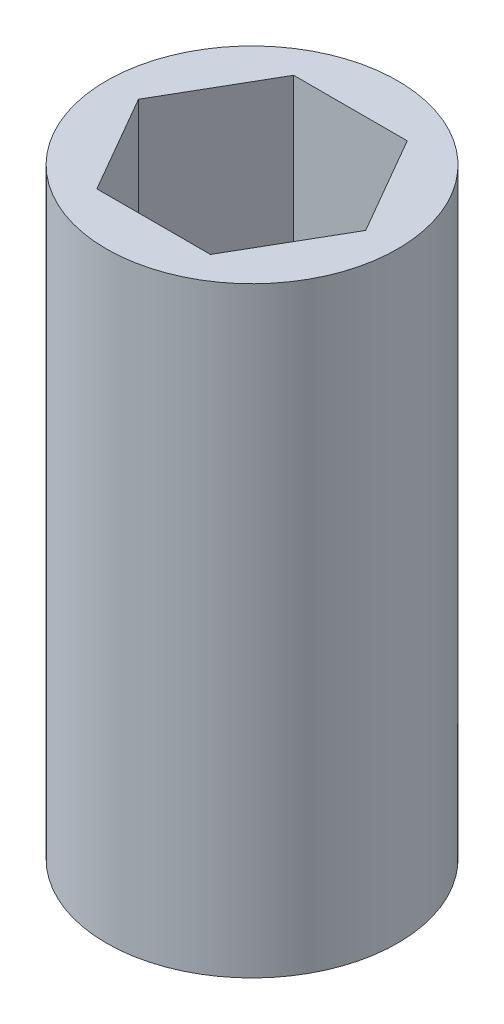
ISO-10303-21;
HEADER;
FILE_DESCRIPTION(('STEP AP214'),'2;1');
FILE_NAME('part.step','',(''),(''),'','','');
FILE_SCHEMA(('AUTOMOTIVE_DESIGN { 1 0 10303 214 1 1 1 1 }'));
ENDSEC;
DATA;
#1=APPLICATION_CONTEXT('core data for automotive mechanical design processes');
#2=APPLICATION_PROTOCOL_DEFINITION('international standard','automotive_design',2000,#1);
#3=PRODUCT_CONTEXT('',#1,'mechanical');
#4=PRODUCT('Part','Part','',(#3));
#5=PRODUCT_RELATED_PRODUCT_CATEGORY('part','',(#4));
#6=PRODUCT_DEFINITION_FORMATION('','',#4);
#7=PRODUCT_DEFINITION_CONTEXT('part definition',#1,'design');
#8=PRODUCT_DEFINITION('design','',#6,#7);
#9=PRODUCT_DEFINITION_SHAPE('','',#8);
#10=(LENGTH_UNIT() NAMED_UNIT(*) SI_UNIT(.MILLI.,.METRE.));
#11=(NAMED_UNIT(*) PLANE_ANGLE_UNIT() SI_UNIT($,.RADIAN.));
#12=(NAMED_UNIT(*) SI_UNIT($,.STERADIAN.) SOLID_ANGLE_UNIT());
#13=UNCERTAINTY_MEASURE_WITH_UNIT(LENGTH_MEASURE(1.E-05),#10,'distance_accuracy_value','');
#14=(GEOMETRIC_REPRESENTATION_CONTEXT(3) GLOBAL_UNCERTAINTY_ASSIGNED_CONTEXT((#13)) GLOBAL_UNIT_ASSIGNED_CONTEXT((#10,
#11,#12)) REPRESENTATION_CONTEXT('',''));
#15=CARTESIAN_POINT('',(0.,0.,0.));
#16=DIRECTION('',(0.,0.,1.));
#17=DIRECTION('',(1.,0.,0.));
#18=AXIS2_PLACEMENT_3D('',#15,#16,#17);
#19=CARTESIAN_POINT('',(0.,14.7447,0.));
#20=DIRECTION('',(0.,1.,0.));
#21=DIRECTION('',(0.,0.,1.));
#22=AXIS2_PLACEMENT_3D('',#19,#20,#21);
#23=PLANE('',#22);
#24=CARTESIAN_POINT('',(0.,14.7447,0.));
#25=DIRECTION('',(0.,1.,0.));
#26=DIRECTION('',(0.,0.,1.));
#27=AXIS2_PLACEMENT_3D('',#24,#25,#26);
#28=CIRCLE('',#27,7.14375);
#29=CARTESIAN_POINT('',(0.,14.7447,7.14375));
#30=VERTEX_POINT('',#29);
#31=EDGE_CURVE('E11',#30,#30,#28,.T.);
#32=ORIENTED_EDGE('',*,*,#31,.T.);
#33=EDGE_LOOP('',(#32));
#34=FACE_BOUND('',#33,.T.);
#35=DIRECTION('',(0.5,0.,-0.866025403784439));
#36=VECTOR('',#35,1.);
#37=CARTESIAN_POINT('',(2.78629239910913,14.7447,4.826));
#38=LINE('',#37,#36);
#39=CARTESIAN_POINT('',(2.78629239910913,14.7447,4.826));
#40=VERTEX_POINT('',#39);
#41=CARTESIAN_POINT('',(5.57258479821827,14.7447,0.));
#42=VERTEX_POINT('',#41);
#43=EDGE_CURVE('E95',#40,#42,#38,.T.);
#44=ORIENTED_EDGE('',*,*,#43,.F.);
#45=DIRECTION('',(1.,0.,0.));
#46=VECTOR('',#45,1.);
#47=CARTESIAN_POINT('',(-2.78629239910913,14.7447,4.826));
#48=LINE('',#47,#46);
#49=CARTESIAN_POINT('',(-2.78629239910913,14.7447,4.826));
#50=VERTEX_POINT('',#49);
#51=EDGE_CURVE('E87',#50,#40,#48,.T.);
#52=ORIENTED_EDGE('',*,*,#51,.F.);
#53=DIRECTION('',(0.5,0.,0.866025403784439));
#54=VECTOR('',#53,1.);
#55=CARTESIAN_POINT('',(-5.57258479821826,14.7447,0.));
#56=LINE('',#55,#54);
#57=CARTESIAN_POINT('',(-5.57258479821826,14.7447,0.));
#58=VERTEX_POINT('',#57);
#59=EDGE_CURVE('E115',#58,#50,#56,.T.);
#60=ORIENTED_EDGE('',*,*,#59,.F.);
#61=DIRECTION('',(-0.5,0.,0.866025403784438));
#62=VECTOR('',#61,1.);
#63=CARTESIAN_POINT('',(-2.78629239910913,14.7447,-4.826));
#64=LINE('',#63,#62);
#65=CARTESIAN_POINT('',(-2.78629239910913,14.7447,-4.826));
#66=VERTEX_POINT('',#65);
#67=EDGE_CURVE('E113',#66,#58,#64,.T.);
#68=ORIENTED_EDGE('',*,*,#67,.F.);
#69=DIRECTION('',(-1.,0.,0.));
#70=VECTOR('',#69,1.);
#71=CARTESIAN_POINT('',(2.78629239910914,14.7447,-4.826));
#72=LINE('',#71,#70);
#73=CARTESIAN_POINT('',(2.78629239910914,14.7447,-4.826));
#74=VERTEX_POINT('',#73);
#75=EDGE_CURVE('E109',#74,#66,#72,.T.);
#76=ORIENTED_EDGE('',*,*,#75,.F.);
#77=DIRECTION('',(-0.5,0.,-0.866025403784439));
#78=VECTOR('',#77,1.);
#79=CARTESIAN_POINT('',(5.57258479821827,14.7447,0.));
#80=LINE('',#79,#78);
#81=EDGE_CURVE('E107',#42,#74,#80,.T.);
#82=ORIENTED_EDGE('',*,*,#81,.F.);
#83=EDGE_LOOP('',(#44,#52,#60,#68,#76,#82));
#84=FACE_BOUND('',#83,.T.);
#85=ADVANCED_FACE('F34',(#34,#84),#23,.T.);
#86=CARTESIAN_POINT('',(0.,-14.7447,0.));
#87=DIRECTION('',(0.,1.,0.));
#88=DIRECTION('',(0.,0.,1.));
#89=AXIS2_PLACEMENT_3D('',#86,#87,#88);
#90=PLANE('',#89);
#91=CARTESIAN_POINT('',(0.,-14.7447,0.));
#92=DIRECTION('',(0.,1.,0.));
#93=DIRECTION('',(0.,0.,1.));
#94=AXIS2_PLACEMENT_3D('',#91,#92,#93);
#95=CIRCLE('',#94,7.14375);
#96=CARTESIAN_POINT('',(0.,-14.7447,7.14375));
#97=VERTEX_POINT('',#96);
#98=EDGE_CURVE('E38',#97,#97,#95,.T.);
#99=ORIENTED_EDGE('',*,*,#98,.F.);
#100=EDGE_LOOP('',(#99));
#101=FACE_BOUND('',#100,.T.);
#102=DIRECTION('',(1.,0.,0.));
#103=VECTOR('',#102,1.);
#104=CARTESIAN_POINT('',(-2.78629239910913,-14.7447,4.826));
#105=LINE('',#104,#103);
#106=CARTESIAN_POINT('',(-2.78629239910913,-14.7447,4.826));
#107=VERTEX_POINT('',#106);
#108=CARTESIAN_POINT('',(2.78629239910913,-14.7447,4.826));
#109=VERTEX_POINT('',#108);
#110=EDGE_CURVE('E57',#107,#109,#105,.T.);
#111=ORIENTED_EDGE('',*,*,#110,.T.);
#112=DIRECTION('',(0.5,0.,-0.866025403784439));
#113=VECTOR('',#112,1.);
#114=CARTESIAN_POINT('',(2.78629239910913,-14.7447,4.826));
#115=LINE('',#114,#113);
#116=CARTESIAN_POINT('',(5.57258479821827,-14.7447,0.));
#117=VERTEX_POINT('',#116);
#118=EDGE_CURVE('E102',#109,#117,#115,.T.);
#119=ORIENTED_EDGE('',*,*,#118,.T.);
#120=DIRECTION('',(-0.5,0.,-0.866025403784439));
#121=VECTOR('',#120,1.);
#122=CARTESIAN_POINT('',(5.57258479821827,-14.7447,0.));
#123=LINE('',#122,#121);
#124=CARTESIAN_POINT('',(2.78629239910914,-14.7447,-4.826));
#125=VERTEX_POINT('',#124);
#126=EDGE_CURVE('E119',#117,#125,#123,.T.);
#127=ORIENTED_EDGE('',*,*,#126,.T.);
#128=DIRECTION('',(-1.,0.,0.));
#129=VECTOR('',#128,1.);
#130=CARTESIAN_POINT('',(2.78629239910914,-14.7447,-4.826));
#131=LINE('',#130,#129);
#132=CARTESIAN_POINT('',(-2.78629239910913,-14.7447,-4.826));
#133=VERTEX_POINT('',#132);
#134=EDGE_CURVE('E122',#125,#133,#131,.T.);
#135=ORIENTED_EDGE('',*,*,#134,.T.);
#136=DIRECTION('',(-0.5,0.,0.866025403784438));
#137=VECTOR('',#136,1.);
#138=CARTESIAN_POINT('',(-2.78629239910913,-14.7447,-4.826));
#139=LINE('',#138,#137);
#140=CARTESIAN_POINT('',(-5.57258479821826,-14.7447,0.));
#141=VERTEX_POINT('',#140);
#142=EDGE_CURVE('E125',#133,#141,#139,.T.);
#143=ORIENTED_EDGE('',*,*,#142,.T.);
#144=DIRECTION('',(0.5,0.,0.866025403784439));
#145=VECTOR('',#144,1.);
#146=CARTESIAN_POINT('',(-5.57258479821826,-14.7447,0.));
#147=LINE('',#146,#145);
#148=EDGE_CURVE('E96',#141,#107,#147,.T.);
#149=ORIENTED_EDGE('',*,*,#148,.T.);
#150=EDGE_LOOP('',(#111,#119,#127,#135,#143,#149));
#151=FACE_BOUND('',#150,.T.);
#152=ADVANCED_FACE('F142',(#101,#151),#90,.F.);
#153=CARTESIAN_POINT('',(0.,14.7447,0.));
#154=DIRECTION('',(0.,-1.,0.));
#155=DIRECTION('',(0.,0.,-1.));
#156=AXIS2_PLACEMENT_3D('',#153,#154,#155);
#157=CYLINDRICAL_SURFACE('',#156,7.14375);
#158=ORIENTED_EDGE('',*,*,#31,.F.);
#159=EDGE_LOOP('',(#158));
#160=FACE_BOUND('',#159,.T.);
#161=ORIENTED_EDGE('',*,*,#98,.T.);
#162=EDGE_LOOP('',(#161));
#163=FACE_BOUND('',#162,.T.);
#164=ADVANCED_FACE('F36',(#160,#163),#157,.T.);
#165=CARTESIAN_POINT('',(-2.78629239910913,14.7447,4.826));
#166=DIRECTION('',(0.,0.,-1.));
#167=DIRECTION('',(-1.,0.,0.));
#168=AXIS2_PLACEMENT_3D('',#165,#166,#167);
#169=PLANE('',#168);
#170=ORIENTED_EDGE('',*,*,#110,.F.);
#171=DIRECTION('',(0.,-1.,0.));
#172=VECTOR('',#171,1.);
#173=CARTESIAN_POINT('',(-2.78629239910913,14.7447,4.826));
#174=LINE('',#173,#172);
#175=EDGE_CURVE('E91',#50,#107,#174,.T.);
#176=ORIENTED_EDGE('',*,*,#175,.F.);
#177=ORIENTED_EDGE('',*,*,#51,.T.);
#178=DIRECTION('',(0.,-1.,0.));
#179=VECTOR('',#178,1.);
#180=CARTESIAN_POINT('',(2.78629239910913,14.7447,4.826));
#181=LINE('',#180,#179);
#182=EDGE_CURVE('E90',#40,#109,#181,.T.);
#183=ORIENTED_EDGE('',*,*,#182,.T.);
#184=EDGE_LOOP('',(#170,#176,#177,#183));
#185=FACE_BOUND('',#184,.T.);
#186=ADVANCED_FACE('F89',(#185),#169,.T.);
#187=CARTESIAN_POINT('',(2.78629239910913,14.7447,4.826));
#188=DIRECTION('',(-0.866025403784439,0.,-0.5));
#189=DIRECTION('',(-0.5,0.,0.866025403784439));
#190=AXIS2_PLACEMENT_3D('',#187,#188,#189);
#191=PLANE('',#190);
#192=ORIENTED_EDGE('',*,*,#118,.F.);
#193=ORIENTED_EDGE('',*,*,#182,.F.);
#194=ORIENTED_EDGE('',*,*,#43,.T.);
#195=DIRECTION('',(0.,-1.,0.));
#196=VECTOR('',#195,1.);
#197=CARTESIAN_POINT('',(5.57258479821827,14.7447,0.));
#198=LINE('',#197,#196);
#199=EDGE_CURVE('E103',#42,#117,#198,.T.);
#200=ORIENTED_EDGE('',*,*,#199,.T.);
#201=EDGE_LOOP('',(#192,#193,#194,#200));
#202=FACE_BOUND('',#201,.T.);
#203=ADVANCED_FACE('F99',(#202),#191,.T.);
#204=CARTESIAN_POINT('',(5.57258479821827,14.7447,0.));
#205=DIRECTION('',(-0.866025403784439,0.,0.5));
#206=DIRECTION('',(0.5,0.,0.866025403784439));
#207=AXIS2_PLACEMENT_3D('',#204,#205,#206);
#208=PLANE('',#207);
#209=ORIENTED_EDGE('',*,*,#126,.F.);
#210=ORIENTED_EDGE('',*,*,#199,.F.);
#211=ORIENTED_EDGE('',*,*,#81,.T.);
#212=DIRECTION('',(0.,-1.,0.));
#213=VECTOR('',#212,1.);
#214=CARTESIAN_POINT('',(2.78629239910914,14.7447,-4.826));
#215=LINE('',#214,#213);
#216=EDGE_CURVE('E134',#74,#125,#215,.T.);
#217=ORIENTED_EDGE('',*,*,#216,.T.);
#218=EDGE_LOOP('',(#209,#210,#211,#217));
#219=FACE_BOUND('',#218,.T.);
#220=ADVANCED_FACE('F138',(#219),#208,.T.);
#221=CARTESIAN_POINT('',(2.78629239910914,14.7447,-4.826));
#222=DIRECTION('',(0.,0.,1.));
#223=DIRECTION('',(1.,0.,0.));
#224=AXIS2_PLACEMENT_3D('',#221,#222,#223);
#225=PLANE('',#224);
#226=ORIENTED_EDGE('',*,*,#134,.F.);
#227=ORIENTED_EDGE('',*,*,#216,.F.);
#228=ORIENTED_EDGE('',*,*,#75,.T.);
#229=DIRECTION('',(0.,-1.,0.));
#230=VECTOR('',#229,1.);
#231=CARTESIAN_POINT('',(-2.78629239910913,14.7447,-4.826));
#232=LINE('',#231,#230);
#233=EDGE_CURVE('E132',#66,#133,#232,.T.);
#234=ORIENTED_EDGE('',*,*,#233,.T.);
#235=EDGE_LOOP('',(#226,#227,#228,#234));
#236=FACE_BOUND('',#235,.T.);
#237=ADVANCED_FACE('F150',(#236),#225,.T.);
#238=CARTESIAN_POINT('',(-2.78629239910913,14.7447,-4.826));
#239=DIRECTION('',(0.866025403784439,0.,0.5));
#240=DIRECTION('',(0.5,0.,-0.866025403784439));
#241=AXIS2_PLACEMENT_3D('',#238,#239,#240);
#242=PLANE('',#241);
#243=ORIENTED_EDGE('',*,*,#142,.F.);
#244=ORIENTED_EDGE('',*,*,#233,.F.);
#245=ORIENTED_EDGE('',*,*,#67,.T.);
#246=DIRECTION('',(0.,-1.,0.));
#247=VECTOR('',#246,1.);
#248=CARTESIAN_POINT('',(-5.57258479821826,14.7447,0.));
#249=LINE('',#248,#247);
#250=EDGE_CURVE('E49',#58,#141,#249,.T.);
#251=ORIENTED_EDGE('',*,*,#250,.T.);
#252=EDGE_LOOP('',(#243,#244,#245,#251));
#253=FACE_BOUND('',#252,.T.);
#254=ADVANCED_FACE('F148',(#253),#242,.T.);
#255=CARTESIAN_POINT('',(-5.57258479821826,14.7447,0.));
#256=DIRECTION('',(0.866025403784439,0.,-0.5));
#257=DIRECTION('',(-0.5,0.,-0.866025403784439));
#258=AXIS2_PLACEMENT_3D('',#255,#256,#257);
#259=PLANE('',#258);
#260=ORIENTED_EDGE('',*,*,#148,.F.);
#261=ORIENTED_EDGE('',*,*,#250,.F.);
#262=ORIENTED_EDGE('',*,*,#59,.T.);
#263=ORIENTED_EDGE('',*,*,#175,.T.);
#264=EDGE_LOOP('',(#260,#261,#262,#263));
#265=FACE_BOUND('',#264,.T.);
#266=ADVANCED_FACE('F144',(#265),#259,.T.);
#267=CLOSED_SHELL('',(#85,#152,#164,#186,#203,#220,#237,#254,#266));
#268=MANIFOLD_SOLID_BREP('B2',#267);
#269=ADVANCED_BREP_SHAPE_REPRESENTATION('',(#18,#268),#14);
#270=SHAPE_DEFINITION_REPRESENTATION(#9,#269);
ENDSEC;
END-ISO-10303-21;
